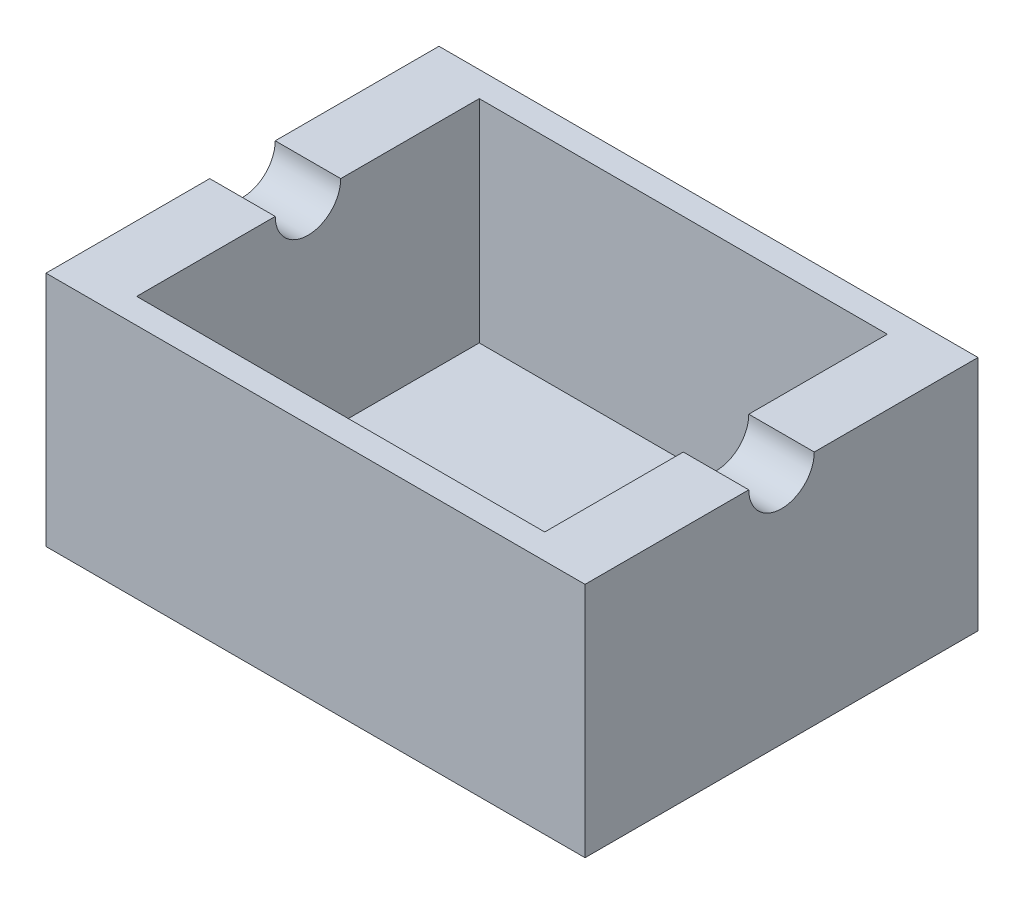
ISO-10303-21;
HEADER;
FILE_DESCRIPTION(('STEP AP214'),'2;1');
FILE_NAME('part.step','',(''),(''),'','','');
FILE_SCHEMA(('AUTOMOTIVE_DESIGN { 1 0 10303 214 1 1 1 1 }'));
ENDSEC;
DATA;
#1=APPLICATION_CONTEXT('core data for automotive mechanical design processes');
#2=APPLICATION_PROTOCOL_DEFINITION('international standard','automotive_design',2000,#1);
#3=PRODUCT_CONTEXT('',#1,'mechanical');
#4=PRODUCT('Part','Part','',(#3));
#5=PRODUCT_RELATED_PRODUCT_CATEGORY('part','',(#4));
#6=PRODUCT_DEFINITION_FORMATION('','',#4);
#7=PRODUCT_DEFINITION_CONTEXT('part definition',#1,'design');
#8=PRODUCT_DEFINITION('design','',#6,#7);
#9=PRODUCT_DEFINITION_SHAPE('','',#8);
#10=(LENGTH_UNIT() NAMED_UNIT(*) SI_UNIT(.MILLI.,.METRE.));
#11=(NAMED_UNIT(*) PLANE_ANGLE_UNIT() SI_UNIT($,.RADIAN.));
#12=(NAMED_UNIT(*) SI_UNIT($,.STERADIAN.) SOLID_ANGLE_UNIT());
#13=UNCERTAINTY_MEASURE_WITH_UNIT(LENGTH_MEASURE(1.E-05),#10,'distance_accuracy_value','');
#14=(GEOMETRIC_REPRESENTATION_CONTEXT(3) GLOBAL_UNCERTAINTY_ASSIGNED_CONTEXT((#13)) GLOBAL_UNIT_ASSIGNED_CONTEXT((#10,
#11,#12)) REPRESENTATION_CONTEXT('',''));
#15=CARTESIAN_POINT('',(0.,0.,0.));
#16=DIRECTION('',(0.,0.,1.));
#17=DIRECTION('',(1.,0.,0.));
#18=AXIS2_PLACEMENT_3D('',#15,#16,#17);
#19=CARTESIAN_POINT('',(0.,16.8,0.));
#20=DIRECTION('',(0.,-1.,0.));
#21=DIRECTION('',(0.,0.,-1.));
#22=AXIS2_PLACEMENT_3D('',#19,#20,#21);
#23=PLANE('',#22);
#24=DIRECTION('',(0.,0.,1.));
#25=VECTOR('',#24,1.);
#26=CARTESIAN_POINT('',(-21.4,16.8,15.6));
#27=LINE('',#26,#25);
#28=CARTESIAN_POINT('',(-21.4,16.8,-15.6));
#29=VERTEX_POINT('',#28);
#30=CARTESIAN_POINT('',(-21.4,16.8,-2.6));
#31=VERTEX_POINT('',#30);
#32=EDGE_CURVE('E150',#29,#31,#27,.T.);
#33=ORIENTED_EDGE('',*,*,#32,.T.);
#34=DIRECTION('',(1.,0.,0.));
#35=VECTOR('',#34,1.);
#36=CARTESIAN_POINT('',(-27.2137767414995,16.8,-2.6));
#37=LINE('',#36,#35);
#38=CARTESIAN_POINT('',(-16.2,16.8,-2.6));
#39=VERTEX_POINT('',#38);
#40=EDGE_CURVE('E135',#31,#39,#37,.T.);
#41=ORIENTED_EDGE('',*,*,#40,.T.);
#42=DIRECTION('',(0.,0.,1.));
#43=VECTOR('',#42,1.);
#44=CARTESIAN_POINT('',(-16.2,16.8,13.6));
#45=LINE('',#44,#43);
#46=CARTESIAN_POINT('',(-16.2,16.8,-13.6));
#47=VERTEX_POINT('',#46);
#48=EDGE_CURVE('E190',#47,#39,#45,.T.);
#49=ORIENTED_EDGE('',*,*,#48,.F.);
#50=DIRECTION('',(-1.,0.,0.));
#51=VECTOR('',#50,1.);
#52=CARTESIAN_POINT('',(-16.2,16.8,-13.6));
#53=LINE('',#52,#51);
#54=CARTESIAN_POINT('',(16.2,16.8,-13.6));
#55=VERTEX_POINT('',#54);
#56=EDGE_CURVE('E187',#55,#47,#53,.T.);
#57=ORIENTED_EDGE('',*,*,#56,.F.);
#58=DIRECTION('',(0.,0.,-1.));
#59=VECTOR('',#58,1.);
#60=CARTESIAN_POINT('',(16.2,16.8,13.6));
#61=LINE('',#60,#59);
#62=CARTESIAN_POINT('',(16.2,16.8,-2.6));
#63=VERTEX_POINT('',#62);
#64=EDGE_CURVE('E134',#63,#55,#61,.T.);
#65=ORIENTED_EDGE('',*,*,#64,.F.);
#66=CARTESIAN_POINT('',(21.4,16.8,-2.6));
#67=VERTEX_POINT('',#66);
#68=EDGE_CURVE('E48',#63,#67,#37,.T.);
#69=ORIENTED_EDGE('',*,*,#68,.T.);
#70=DIRECTION('',(0.,0.,-1.));
#71=VECTOR('',#70,1.);
#72=CARTESIAN_POINT('',(21.4,16.8,15.6));
#73=LINE('',#72,#71);
#74=CARTESIAN_POINT('',(21.4,16.8,-15.6));
#75=VERTEX_POINT('',#74);
#76=EDGE_CURVE('E131',#67,#75,#73,.T.);
#77=ORIENTED_EDGE('',*,*,#76,.T.);
#78=DIRECTION('',(-1.,0.,0.));
#79=VECTOR('',#78,1.);
#80=CARTESIAN_POINT('',(-21.4,16.8,-15.6));
#81=LINE('',#80,#79);
#82=EDGE_CURVE('E142',#75,#29,#81,.T.);
#83=ORIENTED_EDGE('',*,*,#82,.T.);
#84=EDGE_LOOP('',(#33,#41,#49,#57,#65,#69,#77,#83));
#85=FACE_BOUND('',#84,.T.);
#86=ADVANCED_FACE('F33',(#85),#23,.F.);
#87=CARTESIAN_POINT('',(21.4,16.8,15.6));
#88=VERTEX_POINT('',#87);
#89=CARTESIAN_POINT('',(21.4,16.8,2.6));
#90=VERTEX_POINT('',#89);
#91=EDGE_CURVE('E139',#88,#90,#73,.T.);
#92=ORIENTED_EDGE('',*,*,#91,.T.);
#93=DIRECTION('',(1.,0.,0.));
#94=VECTOR('',#93,1.);
#95=CARTESIAN_POINT('',(-27.2137767414995,16.8,2.6));
#96=LINE('',#95,#94);
#97=CARTESIAN_POINT('',(16.2,16.8,2.6));
#98=VERTEX_POINT('',#97);
#99=EDGE_CURVE('E122',#98,#90,#96,.T.);
#100=ORIENTED_EDGE('',*,*,#99,.F.);
#101=CARTESIAN_POINT('',(16.2,16.8,13.6));
#102=VERTEX_POINT('',#101);
#103=EDGE_CURVE('E184',#102,#98,#61,.T.);
#104=ORIENTED_EDGE('',*,*,#103,.F.);
#105=DIRECTION('',(1.,0.,0.));
#106=VECTOR('',#105,1.);
#107=CARTESIAN_POINT('',(-16.2,16.8,13.6));
#108=LINE('',#107,#106);
#109=CARTESIAN_POINT('',(-16.2,16.8,13.6));
#110=VERTEX_POINT('',#109);
#111=EDGE_CURVE('E193',#110,#102,#108,.T.);
#112=ORIENTED_EDGE('',*,*,#111,.F.);
#113=CARTESIAN_POINT('',(-16.2,16.8,2.6));
#114=VERTEX_POINT('',#113);
#115=EDGE_CURVE('E189',#114,#110,#45,.T.);
#116=ORIENTED_EDGE('',*,*,#115,.F.);
#117=CARTESIAN_POINT('',(-21.4,16.8,2.6));
#118=VERTEX_POINT('',#117);
#119=EDGE_CURVE('E55',#118,#114,#96,.T.);
#120=ORIENTED_EDGE('',*,*,#119,.F.);
#121=CARTESIAN_POINT('',(-21.4,16.8,15.6));
#122=VERTEX_POINT('',#121);
#123=EDGE_CURVE('E149',#118,#122,#27,.T.);
#124=ORIENTED_EDGE('',*,*,#123,.T.);
#125=DIRECTION('',(1.,0.,0.));
#126=VECTOR('',#125,1.);
#127=CARTESIAN_POINT('',(-21.4,16.8,15.6));
#128=LINE('',#127,#126);
#129=EDGE_CURVE('E152',#122,#88,#128,.T.);
#130=ORIENTED_EDGE('',*,*,#129,.T.);
#131=EDGE_LOOP('',(#92,#100,#104,#112,#116,#120,#124,#130));
#132=FACE_BOUND('',#131,.T.);
#133=ADVANCED_FACE('F231',(#132),#23,.F.);
#134=CARTESIAN_POINT('',(21.4,16.8,15.6));
#135=DIRECTION('',(-1.,0.,0.));
#136=DIRECTION('',(0.,0.,1.));
#137=AXIS2_PLACEMENT_3D('',#134,#135,#136);
#138=PLANE('',#137);
#139=ORIENTED_EDGE('',*,*,#76,.F.);
#140=CARTESIAN_POINT('',(21.4,16.8,0.));
#141=DIRECTION('',(1.,0.,0.));
#142=DIRECTION('',(0.,0.,1.));
#143=AXIS2_PLACEMENT_3D('',#140,#141,#142);
#144=CIRCLE('',#143,2.6);
#145=EDGE_CURVE('E119',#90,#67,#144,.T.);
#146=ORIENTED_EDGE('',*,*,#145,.F.);
#147=ORIENTED_EDGE('',*,*,#91,.F.);
#148=DIRECTION('',(0.,-1.,0.));
#149=VECTOR('',#148,1.);
#150=CARTESIAN_POINT('',(21.4,16.8,15.6));
#151=LINE('',#150,#149);
#152=CARTESIAN_POINT('',(21.4,-2.,15.6));
#153=VERTEX_POINT('',#152);
#154=EDGE_CURVE('E154',#88,#153,#151,.T.);
#155=ORIENTED_EDGE('',*,*,#154,.T.);
#156=DIRECTION('',(0.,0.,-1.));
#157=VECTOR('',#156,1.);
#158=CARTESIAN_POINT('',(21.4,-2.,0.));
#159=LINE('',#158,#157);
#160=CARTESIAN_POINT('',(21.4,-2.,-15.6));
#161=VERTEX_POINT('',#160);
#162=EDGE_CURVE('E170',#153,#161,#159,.T.);
#163=ORIENTED_EDGE('',*,*,#162,.T.);
#164=DIRECTION('',(0.,-1.,0.));
#165=VECTOR('',#164,1.);
#166=CARTESIAN_POINT('',(21.4,16.8,-15.6));
#167=LINE('',#166,#165);
#168=EDGE_CURVE('E41',#75,#161,#167,.T.);
#169=ORIENTED_EDGE('',*,*,#168,.F.);
#170=EDGE_LOOP('',(#139,#146,#147,#155,#163,#169));
#171=FACE_BOUND('',#170,.T.);
#172=ADVANCED_FACE('F35',(#171),#138,.F.);
#173=CARTESIAN_POINT('',(-21.4,16.8,-15.6));
#174=DIRECTION('',(0.,0.,1.));
#175=DIRECTION('',(1.,0.,0.));
#176=AXIS2_PLACEMENT_3D('',#173,#174,#175);
#177=PLANE('',#176);
#178=ORIENTED_EDGE('',*,*,#168,.T.);
#179=DIRECTION('',(1.,0.,0.));
#180=VECTOR('',#179,1.);
#181=CARTESIAN_POINT('',(0.,-2.,-15.6));
#182=LINE('',#181,#180);
#183=CARTESIAN_POINT('',(-21.4,-2.,-15.6));
#184=VERTEX_POINT('',#183);
#185=EDGE_CURVE('E164',#184,#161,#182,.T.);
#186=ORIENTED_EDGE('',*,*,#185,.F.);
#187=DIRECTION('',(0.,-1.,0.));
#188=VECTOR('',#187,1.);
#189=CARTESIAN_POINT('',(-21.4,16.8,-15.6));
#190=LINE('',#189,#188);
#191=EDGE_CURVE('E158',#29,#184,#190,.T.);
#192=ORIENTED_EDGE('',*,*,#191,.F.);
#193=ORIENTED_EDGE('',*,*,#82,.F.);
#194=EDGE_LOOP('',(#178,#186,#192,#193));
#195=FACE_BOUND('',#194,.T.);
#196=ADVANCED_FACE('F162',(#195),#177,.F.);
#197=CARTESIAN_POINT('',(-21.4,16.8,15.6));
#198=DIRECTION('',(1.,0.,0.));
#199=DIRECTION('',(0.,0.,-1.));
#200=AXIS2_PLACEMENT_3D('',#197,#198,#199);
#201=PLANE('',#200);
#202=ORIENTED_EDGE('',*,*,#123,.F.);
#203=CARTESIAN_POINT('',(-21.4,16.8,0.));
#204=DIRECTION('',(1.,0.,0.));
#205=DIRECTION('',(0.,0.,-1.));
#206=AXIS2_PLACEMENT_3D('',#203,#204,#205);
#207=CIRCLE('',#206,2.6);
#208=EDGE_CURVE('E232',#31,#118,#207,.F.);
#209=ORIENTED_EDGE('',*,*,#208,.F.);
#210=ORIENTED_EDGE('',*,*,#32,.F.);
#211=ORIENTED_EDGE('',*,*,#191,.T.);
#212=DIRECTION('',(0.,0.,-1.));
#213=VECTOR('',#212,1.);
#214=CARTESIAN_POINT('',(-21.4,-2.,0.));
#215=LINE('',#214,#213);
#216=CARTESIAN_POINT('',(-21.4,-2.,15.6));
#217=VERTEX_POINT('',#216);
#218=EDGE_CURVE('E173',#217,#184,#215,.T.);
#219=ORIENTED_EDGE('',*,*,#218,.F.);
#220=DIRECTION('',(0.,-1.,0.));
#221=VECTOR('',#220,1.);
#222=CARTESIAN_POINT('',(-21.4,16.8,15.6));
#223=LINE('',#222,#221);
#224=EDGE_CURVE('E156',#122,#217,#223,.T.);
#225=ORIENTED_EDGE('',*,*,#224,.F.);
#226=EDGE_LOOP('',(#202,#209,#210,#211,#219,#225));
#227=FACE_BOUND('',#226,.T.);
#228=ADVANCED_FACE('F257',(#227),#201,.F.);
#229=CARTESIAN_POINT('',(-21.4,16.8,15.6));
#230=DIRECTION('',(0.,0.,-1.));
#231=DIRECTION('',(-1.,0.,0.));
#232=AXIS2_PLACEMENT_3D('',#229,#230,#231);
#233=PLANE('',#232);
#234=ORIENTED_EDGE('',*,*,#224,.T.);
#235=DIRECTION('',(1.,0.,0.));
#236=VECTOR('',#235,1.);
#237=CARTESIAN_POINT('',(0.,-2.,15.6));
#238=LINE('',#237,#236);
#239=EDGE_CURVE('E176',#217,#153,#238,.T.);
#240=ORIENTED_EDGE('',*,*,#239,.T.);
#241=ORIENTED_EDGE('',*,*,#154,.F.);
#242=ORIENTED_EDGE('',*,*,#129,.F.);
#243=EDGE_LOOP('',(#234,#240,#241,#242));
#244=FACE_BOUND('',#243,.T.);
#245=ADVANCED_FACE('F254',(#244),#233,.F.);
#246=CARTESIAN_POINT('',(16.2,16.8,13.6));
#247=DIRECTION('',(-1.,0.,0.));
#248=DIRECTION('',(0.,0.,1.));
#249=AXIS2_PLACEMENT_3D('',#246,#247,#248);
#250=PLANE('',#249);
#251=CARTESIAN_POINT('',(16.2,16.8,0.));
#252=DIRECTION('',(-1.,0.,0.));
#253=DIRECTION('',(0.,0.,1.));
#254=AXIS2_PLACEMENT_3D('',#251,#252,#253);
#255=CIRCLE('',#254,2.6);
#256=EDGE_CURVE('E178',#63,#98,#255,.T.);
#257=ORIENTED_EDGE('',*,*,#256,.F.);
#258=ORIENTED_EDGE('',*,*,#64,.T.);
#259=DIRECTION('',(0.,-1.,0.));
#260=VECTOR('',#259,1.);
#261=CARTESIAN_POINT('',(16.2,16.8,-13.6));
#262=LINE('',#261,#260);
#263=CARTESIAN_POINT('',(16.2,0.,-13.6));
#264=VERTEX_POINT('',#263);
#265=EDGE_CURVE('E140',#55,#264,#262,.T.);
#266=ORIENTED_EDGE('',*,*,#265,.T.);
#267=DIRECTION('',(0.,0.,-1.));
#268=VECTOR('',#267,1.);
#269=CARTESIAN_POINT('',(16.2,0.,13.6));
#270=LINE('',#269,#268);
#271=CARTESIAN_POINT('',(16.2,0.,13.6));
#272=VERTEX_POINT('',#271);
#273=EDGE_CURVE('E183',#272,#264,#270,.T.);
#274=ORIENTED_EDGE('',*,*,#273,.F.);
#275=DIRECTION('',(0.,-1.,0.));
#276=VECTOR('',#275,1.);
#277=CARTESIAN_POINT('',(16.2,16.8,13.6));
#278=LINE('',#277,#276);
#279=EDGE_CURVE('E195',#102,#272,#278,.T.);
#280=ORIENTED_EDGE('',*,*,#279,.F.);
#281=ORIENTED_EDGE('',*,*,#103,.T.);
#282=EDGE_LOOP('',(#257,#258,#266,#274,#280,#281));
#283=FACE_BOUND('',#282,.T.);
#284=ADVANCED_FACE('F224',(#283),#250,.T.);
#285=CARTESIAN_POINT('',(-16.2,16.8,-13.6));
#286=DIRECTION('',(0.,0.,1.));
#287=DIRECTION('',(1.,0.,0.));
#288=AXIS2_PLACEMENT_3D('',#285,#286,#287);
#289=PLANE('',#288);
#290=DIRECTION('',(-1.,0.,0.));
#291=VECTOR('',#290,1.);
#292=CARTESIAN_POINT('',(-16.2,0.,-13.6));
#293=LINE('',#292,#291);
#294=CARTESIAN_POINT('',(-16.2,0.,-13.6));
#295=VERTEX_POINT('',#294);
#296=EDGE_CURVE('E198',#264,#295,#293,.T.);
#297=ORIENTED_EDGE('',*,*,#296,.F.);
#298=ORIENTED_EDGE('',*,*,#265,.F.);
#299=ORIENTED_EDGE('',*,*,#56,.T.);
#300=DIRECTION('',(0.,-1.,0.));
#301=VECTOR('',#300,1.);
#302=CARTESIAN_POINT('',(-16.2,16.8,-13.6));
#303=LINE('',#302,#301);
#304=EDGE_CURVE('E144',#47,#295,#303,.T.);
#305=ORIENTED_EDGE('',*,*,#304,.T.);
#306=EDGE_LOOP('',(#297,#298,#299,#305));
#307=FACE_BOUND('',#306,.T.);
#308=ADVANCED_FACE('F214',(#307),#289,.T.);
#309=CARTESIAN_POINT('',(-16.2,16.8,13.6));
#310=DIRECTION('',(1.,0.,0.));
#311=DIRECTION('',(0.,0.,-1.));
#312=AXIS2_PLACEMENT_3D('',#309,#310,#311);
#313=PLANE('',#312);
#314=CARTESIAN_POINT('',(-16.2,16.8,0.));
#315=DIRECTION('',(1.,0.,0.));
#316=DIRECTION('',(0.,0.,-1.));
#317=AXIS2_PLACEMENT_3D('',#314,#315,#316);
#318=CIRCLE('',#317,2.6);
#319=EDGE_CURVE('E11',#114,#39,#318,.T.);
#320=ORIENTED_EDGE('',*,*,#319,.F.);
#321=ORIENTED_EDGE('',*,*,#115,.T.);
#322=DIRECTION('',(0.,-1.,0.));
#323=VECTOR('',#322,1.);
#324=CARTESIAN_POINT('',(-16.2,16.8,13.6));
#325=LINE('',#324,#323);
#326=CARTESIAN_POINT('',(-16.2,0.,13.6));
#327=VERTEX_POINT('',#326);
#328=EDGE_CURVE('E209',#110,#327,#325,.T.);
#329=ORIENTED_EDGE('',*,*,#328,.T.);
#330=DIRECTION('',(0.,0.,1.));
#331=VECTOR('',#330,1.);
#332=CARTESIAN_POINT('',(-16.2,0.,13.6));
#333=LINE('',#332,#331);
#334=EDGE_CURVE('E201',#295,#327,#333,.T.);
#335=ORIENTED_EDGE('',*,*,#334,.F.);
#336=ORIENTED_EDGE('',*,*,#304,.F.);
#337=ORIENTED_EDGE('',*,*,#48,.T.);
#338=EDGE_LOOP('',(#320,#321,#329,#335,#336,#337));
#339=FACE_BOUND('',#338,.T.);
#340=ADVANCED_FACE('F218',(#339),#313,.T.);
#341=CARTESIAN_POINT('',(-16.2,16.8,13.6));
#342=DIRECTION('',(0.,0.,-1.));
#343=DIRECTION('',(-1.,0.,0.));
#344=AXIS2_PLACEMENT_3D('',#341,#342,#343);
#345=PLANE('',#344);
#346=DIRECTION('',(1.,0.,0.));
#347=VECTOR('',#346,1.);
#348=CARTESIAN_POINT('',(-16.2,0.,13.6));
#349=LINE('',#348,#347);
#350=EDGE_CURVE('E204',#327,#272,#349,.T.);
#351=ORIENTED_EDGE('',*,*,#350,.F.);
#352=ORIENTED_EDGE('',*,*,#328,.F.);
#353=ORIENTED_EDGE('',*,*,#111,.T.);
#354=ORIENTED_EDGE('',*,*,#279,.T.);
#355=EDGE_LOOP('',(#351,#352,#353,#354));
#356=FACE_BOUND('',#355,.T.);
#357=ADVANCED_FACE('F227',(#356),#345,.T.);
#358=CARTESIAN_POINT('',(0.,0.,0.));
#359=DIRECTION('',(0.,1.,0.));
#360=DIRECTION('',(0.,0.,1.));
#361=AXIS2_PLACEMENT_3D('',#358,#359,#360);
#362=PLANE('',#361);
#363=ORIENTED_EDGE('',*,*,#334,.T.);
#364=ORIENTED_EDGE('',*,*,#350,.T.);
#365=ORIENTED_EDGE('',*,*,#273,.T.);
#366=ORIENTED_EDGE('',*,*,#296,.T.);
#367=EDGE_LOOP('',(#363,#364,#365,#366));
#368=FACE_BOUND('',#367,.T.);
#369=ADVANCED_FACE('F221',(#368),#362,.T.);
#370=CARTESIAN_POINT('',(0.,-2.,0.));
#371=DIRECTION('',(0.,1.,0.));
#372=DIRECTION('',(0.,0.,1.));
#373=AXIS2_PLACEMENT_3D('',#370,#371,#372);
#374=PLANE('',#373);
#375=ORIENTED_EDGE('',*,*,#239,.F.);
#376=ORIENTED_EDGE('',*,*,#218,.T.);
#377=ORIENTED_EDGE('',*,*,#185,.T.);
#378=ORIENTED_EDGE('',*,*,#162,.F.);
#379=EDGE_LOOP('',(#375,#376,#377,#378));
#380=FACE_BOUND('',#379,.T.);
#381=ADVANCED_FACE('F169',(#380),#374,.F.);
#382=CARTESIAN_POINT('',(-27.2137767414995,16.8,0.));
#383=DIRECTION('',(1.,0.,0.));
#384=DIRECTION('',(0.,0.,-1.));
#385=AXIS2_PLACEMENT_3D('',#382,#383,#384);
#386=CYLINDRICAL_SURFACE('',#385,2.6);
#387=ORIENTED_EDGE('',*,*,#319,.T.);
#388=ORIENTED_EDGE('',*,*,#40,.F.);
#389=ORIENTED_EDGE('',*,*,#208,.T.);
#390=ORIENTED_EDGE('',*,*,#119,.T.);
#391=EDGE_LOOP('',(#387,#388,#389,#390));
#392=FACE_BOUND('',#391,.T.);
#393=ADVANCED_FACE('F238',(#392),#386,.F.);
#394=ORIENTED_EDGE('',*,*,#256,.T.);
#395=ORIENTED_EDGE('',*,*,#99,.T.);
#396=ORIENTED_EDGE('',*,*,#145,.T.);
#397=ORIENTED_EDGE('',*,*,#68,.F.);
#398=EDGE_LOOP('',(#394,#395,#396,#397));
#399=FACE_BOUND('',#398,.T.);
#400=ADVANCED_FACE('F120',(#399),#386,.F.);
#401=CLOSED_SHELL('',(#86,#133,#172,#196,#228,#245,#284,#308,#340,#357,#369,#381,#393,#400));
#402=MANIFOLD_SOLID_BREP('B2',#401);
#403=ADVANCED_BREP_SHAPE_REPRESENTATION('',(#18,#402),#14);
#404=SHAPE_DEFINITION_REPRESENTATION(#9,#403);
ENDSEC;
END-ISO-10303-21;
